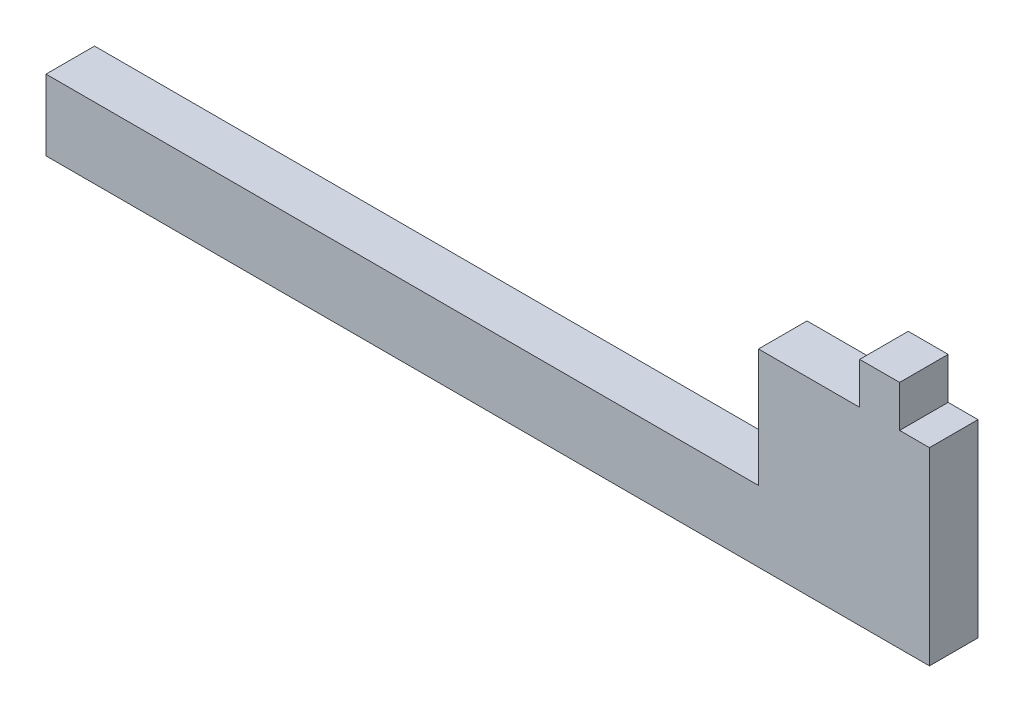
ISO-10303-21;
HEADER;
FILE_DESCRIPTION(('STEP AP214'),'2;1');
FILE_NAME('part.step','',(''),(''),'','','');
FILE_SCHEMA(('AUTOMOTIVE_DESIGN { 1 0 10303 214 1 1 1 1 }'));
ENDSEC;
DATA;
#1=APPLICATION_CONTEXT('core data for automotive mechanical design processes');
#2=APPLICATION_PROTOCOL_DEFINITION('international standard','automotive_design',2000,#1);
#3=PRODUCT_CONTEXT('',#1,'mechanical');
#4=PRODUCT('Part','Part','',(#3));
#5=PRODUCT_RELATED_PRODUCT_CATEGORY('part','',(#4));
#6=PRODUCT_DEFINITION_FORMATION('','',#4);
#7=PRODUCT_DEFINITION_CONTEXT('part definition',#1,'design');
#8=PRODUCT_DEFINITION('design','',#6,#7);
#9=PRODUCT_DEFINITION_SHAPE('','',#8);
#10=(LENGTH_UNIT() NAMED_UNIT(*) SI_UNIT(.MILLI.,.METRE.));
#11=(NAMED_UNIT(*) PLANE_ANGLE_UNIT() SI_UNIT($,.RADIAN.));
#12=(NAMED_UNIT(*) SI_UNIT($,.STERADIAN.) SOLID_ANGLE_UNIT());
#13=UNCERTAINTY_MEASURE_WITH_UNIT(LENGTH_MEASURE(1.E-05),#10,'distance_accuracy_value','');
#14=(GEOMETRIC_REPRESENTATION_CONTEXT(3) GLOBAL_UNCERTAINTY_ASSIGNED_CONTEXT((#13)) GLOBAL_UNIT_ASSIGNED_CONTEXT((#10,
#11,#12)) REPRESENTATION_CONTEXT('',''));
#15=CARTESIAN_POINT('',(0.,0.,0.));
#16=DIRECTION('',(0.,0.,1.));
#17=DIRECTION('',(1.,0.,0.));
#18=AXIS2_PLACEMENT_3D('',#15,#16,#17);
#19=CARTESIAN_POINT('',(90.985763710765,0.,9.144));
#20=DIRECTION('',(1.,0.,0.));
#21=DIRECTION('',(0.,0.,-1.));
#22=AXIS2_PLACEMENT_3D('',#19,#20,#21);
#23=PLANE('',#22);
#24=DIRECTION('',(0.,-1.,0.));
#25=VECTOR('',#24,1.);
#26=CARTESIAN_POINT('',(90.985763710765,0.,5.588));
#27=LINE('',#26,#25);
#28=CARTESIAN_POINT('',(90.985763710765,45.3470028132748,5.588));
#29=VERTEX_POINT('',#28);
#30=CARTESIAN_POINT('',(90.985763710765,42.3012441594208,5.588));
#31=VERTEX_POINT('',#30);
#32=EDGE_CURVE('E151',#29,#31,#27,.T.);
#33=ORIENTED_EDGE('',*,*,#32,.T.);
#34=DIRECTION('',(0.,0.,-1.));
#35=VECTOR('',#34,1.);
#36=CARTESIAN_POINT('',(90.985763710765,42.3012441594208,9.144));
#37=LINE('',#36,#35);
#38=CARTESIAN_POINT('',(90.985763710765,42.3012441594208,9.144));
#39=VERTEX_POINT('',#38);
#40=EDGE_CURVE('E11',#39,#31,#37,.T.);
#41=ORIENTED_EDGE('',*,*,#40,.F.);
#42=DIRECTION('',(0.,-1.,0.));
#43=VECTOR('',#42,1.);
#44=CARTESIAN_POINT('',(90.985763710765,0.,9.144));
#45=LINE('',#44,#43);
#46=CARTESIAN_POINT('',(90.985763710765,45.3470028132748,9.144));
#47=VERTEX_POINT('',#46);
#48=EDGE_CURVE('E169',#47,#39,#45,.T.);
#49=ORIENTED_EDGE('',*,*,#48,.F.);
#50=DIRECTION('',(0.,0.,-1.));
#51=VECTOR('',#50,1.);
#52=CARTESIAN_POINT('',(90.985763710765,45.3470028132748,9.144));
#53=LINE('',#52,#51);
#54=EDGE_CURVE('E147',#47,#29,#53,.T.);
#55=ORIENTED_EDGE('',*,*,#54,.T.);
#56=EDGE_LOOP('',(#33,#41,#49,#55));
#57=FACE_BOUND('',#56,.T.);
#58=ADVANCED_FACE('F43',(#57),#23,.F.);
#59=CARTESIAN_POINT('',(0.,42.3012441594208,9.144));
#60=DIRECTION('',(0.,-1.,0.));
#61=DIRECTION('',(0.,0.,-1.));
#62=AXIS2_PLACEMENT_3D('',#59,#60,#61);
#63=PLANE('',#62);
#64=DIRECTION('',(-1.,0.,0.));
#65=VECTOR('',#64,1.);
#66=CARTESIAN_POINT('',(0.,42.3012441594208,5.588));
#67=LINE('',#66,#65);
#68=CARTESIAN_POINT('',(83.5743801353392,42.3012441594208,5.588));
#69=VERTEX_POINT('',#68);
#70=EDGE_CURVE('E154',#31,#69,#67,.T.);
#71=ORIENTED_EDGE('',*,*,#70,.T.);
#72=DIRECTION('',(0.,0.,-1.));
#73=VECTOR('',#72,1.);
#74=CARTESIAN_POINT('',(83.5743801353392,42.3012441594208,9.144));
#75=LINE('',#74,#73);
#76=CARTESIAN_POINT('',(83.5743801353392,42.3012441594208,9.144));
#77=VERTEX_POINT('',#76);
#78=EDGE_CURVE('E51',#77,#69,#75,.T.);
#79=ORIENTED_EDGE('',*,*,#78,.F.);
#80=DIRECTION('',(-1.,0.,0.));
#81=VECTOR('',#80,1.);
#82=CARTESIAN_POINT('',(0.,42.3012441594208,9.144));
#83=LINE('',#82,#81);
#84=EDGE_CURVE('E108',#39,#77,#83,.T.);
#85=ORIENTED_EDGE('',*,*,#84,.F.);
#86=ORIENTED_EDGE('',*,*,#40,.T.);
#87=EDGE_LOOP('',(#71,#79,#85,#86));
#88=FACE_BOUND('',#87,.T.);
#89=ADVANCED_FACE('F218',(#88),#63,.F.);
#90=CARTESIAN_POINT('',(83.5743801353392,0.,9.144));
#91=DIRECTION('',(1.,0.,0.));
#92=DIRECTION('',(0.,0.,-1.));
#93=AXIS2_PLACEMENT_3D('',#90,#91,#92);
#94=PLANE('',#93);
#95=DIRECTION('',(0.,-1.,0.));
#96=VECTOR('',#95,1.);
#97=CARTESIAN_POINT('',(83.5743801353392,0.,5.588));
#98=LINE('',#97,#96);
#99=CARTESIAN_POINT('',(83.5743801353392,33.6426290683932,5.588));
#100=VERTEX_POINT('',#99);
#101=EDGE_CURVE('E156',#69,#100,#98,.T.);
#102=ORIENTED_EDGE('',*,*,#101,.T.);
#103=DIRECTION('',(0.,0.,-1.));
#104=VECTOR('',#103,1.);
#105=CARTESIAN_POINT('',(83.5743801353392,33.6426290683932,9.144));
#106=LINE('',#105,#104);
#107=CARTESIAN_POINT('',(83.5743801353392,33.6426290683932,9.144));
#108=VERTEX_POINT('',#107);
#109=EDGE_CURVE('E182',#108,#100,#106,.T.);
#110=ORIENTED_EDGE('',*,*,#109,.F.);
#111=DIRECTION('',(0.,-1.,0.));
#112=VECTOR('',#111,1.);
#113=CARTESIAN_POINT('',(83.5743801353392,0.,9.144));
#114=LINE('',#113,#112);
#115=EDGE_CURVE('E190',#77,#108,#114,.T.);
#116=ORIENTED_EDGE('',*,*,#115,.F.);
#117=ORIENTED_EDGE('',*,*,#78,.T.);
#118=EDGE_LOOP('',(#102,#110,#116,#117));
#119=FACE_BOUND('',#118,.T.);
#120=ADVANCED_FACE('F188',(#119),#94,.F.);
#121=CARTESIAN_POINT('',(0.,33.6426290683932,9.144));
#122=DIRECTION('',(0.,-1.,0.));
#123=DIRECTION('',(0.,0.,-1.));
#124=AXIS2_PLACEMENT_3D('',#121,#122,#123);
#125=PLANE('',#124);
#126=DIRECTION('',(-1.,0.,0.));
#127=VECTOR('',#126,1.);
#128=CARTESIAN_POINT('',(0.,33.6426290683932,5.588));
#129=LINE('',#128,#127);
#130=CARTESIAN_POINT('',(31.390903290393,33.6426290683932,5.588));
#131=VERTEX_POINT('',#130);
#132=EDGE_CURVE('E158',#100,#131,#129,.T.);
#133=ORIENTED_EDGE('',*,*,#132,.T.);
#134=DIRECTION('',(0.,0.,-1.));
#135=VECTOR('',#134,1.);
#136=CARTESIAN_POINT('',(31.390903290393,33.6426290683932,9.144));
#137=LINE('',#136,#135);
#138=CARTESIAN_POINT('',(31.390903290393,33.6426290683932,9.144));
#139=VERTEX_POINT('',#138);
#140=EDGE_CURVE('E179',#139,#131,#137,.T.);
#141=ORIENTED_EDGE('',*,*,#140,.F.);
#142=DIRECTION('',(-1.,0.,0.));
#143=VECTOR('',#142,1.);
#144=CARTESIAN_POINT('',(0.,33.6426290683932,9.144));
#145=LINE('',#144,#143);
#146=EDGE_CURVE('E208',#108,#139,#145,.T.);
#147=ORIENTED_EDGE('',*,*,#146,.F.);
#148=ORIENTED_EDGE('',*,*,#109,.T.);
#149=EDGE_LOOP('',(#133,#141,#147,#148));
#150=FACE_BOUND('',#149,.T.);
#151=ADVANCED_FACE('F199',(#150),#125,.F.);
#152=CARTESIAN_POINT('',(31.390903290393,0.,9.144));
#153=DIRECTION('',(1.,0.,0.));
#154=DIRECTION('',(0.,0.,-1.));
#155=AXIS2_PLACEMENT_3D('',#152,#153,#154);
#156=PLANE('',#155);
#157=DIRECTION('',(0.,-1.,0.));
#158=VECTOR('',#157,1.);
#159=CARTESIAN_POINT('',(31.390903290393,0.,5.588));
#160=LINE('',#159,#158);
#161=CARTESIAN_POINT('',(31.390903290393,28.4550367389928,5.588));
#162=VERTEX_POINT('',#161);
#163=EDGE_CURVE('E160',#131,#162,#160,.T.);
#164=ORIENTED_EDGE('',*,*,#163,.T.);
#165=DIRECTION('',(0.,0.,-1.));
#166=VECTOR('',#165,1.);
#167=CARTESIAN_POINT('',(31.390903290393,28.4550367389928,9.144));
#168=LINE('',#167,#166);
#169=CARTESIAN_POINT('',(31.390903290393,28.4550367389928,9.144));
#170=VERTEX_POINT('',#169);
#171=EDGE_CURVE('E176',#170,#162,#168,.T.);
#172=ORIENTED_EDGE('',*,*,#171,.F.);
#173=DIRECTION('',(0.,-1.,0.));
#174=VECTOR('',#173,1.);
#175=CARTESIAN_POINT('',(31.390903290393,0.,9.144));
#176=LINE('',#175,#174);
#177=EDGE_CURVE('E205',#139,#170,#176,.T.);
#178=ORIENTED_EDGE('',*,*,#177,.F.);
#179=ORIENTED_EDGE('',*,*,#140,.T.);
#180=EDGE_LOOP('',(#164,#172,#178,#179));
#181=FACE_BOUND('',#180,.T.);
#182=ADVANCED_FACE('F203',(#181),#156,.F.);
#183=CARTESIAN_POINT('',(0.,28.4550367389928,9.144));
#184=DIRECTION('',(0.,1.,0.));
#185=DIRECTION('',(0.,0.,1.));
#186=AXIS2_PLACEMENT_3D('',#183,#184,#185);
#187=PLANE('',#186);
#188=DIRECTION('',(1.,0.,0.));
#189=VECTOR('',#188,1.);
#190=CARTESIAN_POINT('',(0.,28.4550367389928,5.588));
#191=LINE('',#190,#189);
#192=CARTESIAN_POINT('',(96.0957504485511,28.4550367389928,5.588));
#193=VERTEX_POINT('',#192);
#194=EDGE_CURVE('E162',#162,#193,#191,.T.);
#195=ORIENTED_EDGE('',*,*,#194,.T.);
#196=DIRECTION('',(0.,0.,-1.));
#197=VECTOR('',#196,1.);
#198=CARTESIAN_POINT('',(96.0957504485511,28.4550367389928,9.144));
#199=LINE('',#198,#197);
#200=CARTESIAN_POINT('',(96.0957504485511,28.4550367389928,9.144));
#201=VERTEX_POINT('',#200);
#202=EDGE_CURVE('E173',#201,#193,#199,.T.);
#203=ORIENTED_EDGE('',*,*,#202,.F.);
#204=DIRECTION('',(1.,0.,0.));
#205=VECTOR('',#204,1.);
#206=CARTESIAN_POINT('',(0.,28.4550367389928,9.144));
#207=LINE('',#206,#205);
#208=EDGE_CURVE('E207',#170,#201,#207,.T.);
#209=ORIENTED_EDGE('',*,*,#208,.F.);
#210=ORIENTED_EDGE('',*,*,#171,.T.);
#211=EDGE_LOOP('',(#195,#203,#209,#210));
#212=FACE_BOUND('',#211,.T.);
#213=ADVANCED_FACE('F230',(#212),#187,.F.);
#214=CARTESIAN_POINT('',(96.0957504485511,0.,9.144));
#215=DIRECTION('',(-1.,0.,0.));
#216=DIRECTION('',(0.,0.,1.));
#217=AXIS2_PLACEMENT_3D('',#214,#215,#216);
#218=PLANE('',#217);
#219=DIRECTION('',(0.,1.,0.));
#220=VECTOR('',#219,1.);
#221=CARTESIAN_POINT('',(96.0957504485511,0.,5.588));
#222=LINE('',#221,#220);
#223=CARTESIAN_POINT('',(96.0957504485511,42.3012441594208,5.588));
#224=VERTEX_POINT('',#223);
#225=EDGE_CURVE('E164',#193,#224,#222,.T.);
#226=ORIENTED_EDGE('',*,*,#225,.T.);
#227=DIRECTION('',(0.,0.,-1.));
#228=VECTOR('',#227,1.);
#229=CARTESIAN_POINT('',(96.0957504485511,42.3012441594208,9.144));
#230=LINE('',#229,#228);
#231=CARTESIAN_POINT('',(96.0957504485511,42.3012441594208,9.144));
#232=VERTEX_POINT('',#231);
#233=EDGE_CURVE('E142',#232,#224,#230,.T.);
#234=ORIENTED_EDGE('',*,*,#233,.F.);
#235=DIRECTION('',(0.,1.,0.));
#236=VECTOR('',#235,1.);
#237=CARTESIAN_POINT('',(96.0957504485511,0.,9.144));
#238=LINE('',#237,#236);
#239=EDGE_CURVE('E133',#201,#232,#238,.T.);
#240=ORIENTED_EDGE('',*,*,#239,.F.);
#241=ORIENTED_EDGE('',*,*,#202,.T.);
#242=EDGE_LOOP('',(#226,#234,#240,#241));
#243=FACE_BOUND('',#242,.T.);
#244=ADVANCED_FACE('F233',(#243),#218,.F.);
#245=CARTESIAN_POINT('',(0.,42.3012441594208,9.144));
#246=DIRECTION('',(0.,-1.,0.));
#247=DIRECTION('',(0.,0.,-1.));
#248=AXIS2_PLACEMENT_3D('',#245,#246,#247);
#249=PLANE('',#248);
#250=DIRECTION('',(-1.,0.,0.));
#251=VECTOR('',#250,1.);
#252=CARTESIAN_POINT('',(0.,42.3012441594208,5.588));
#253=LINE('',#252,#251);
#254=CARTESIAN_POINT('',(93.9105154479826,42.3012441594208,5.588));
#255=VERTEX_POINT('',#254);
#256=EDGE_CURVE('E141',#224,#255,#253,.T.);
#257=ORIENTED_EDGE('',*,*,#256,.T.);
#258=DIRECTION('',(0.,0.,-1.));
#259=VECTOR('',#258,1.);
#260=CARTESIAN_POINT('',(93.9105154479826,42.3012441594208,9.144));
#261=LINE('',#260,#259);
#262=CARTESIAN_POINT('',(93.9105154479826,42.3012441594208,9.144));
#263=VERTEX_POINT('',#262);
#264=EDGE_CURVE('E138',#263,#255,#261,.T.);
#265=ORIENTED_EDGE('',*,*,#264,.F.);
#266=DIRECTION('',(-1.,0.,0.));
#267=VECTOR('',#266,1.);
#268=CARTESIAN_POINT('',(0.,42.3012441594208,9.144));
#269=LINE('',#268,#267);
#270=EDGE_CURVE('E127',#232,#263,#269,.T.);
#271=ORIENTED_EDGE('',*,*,#270,.F.);
#272=ORIENTED_EDGE('',*,*,#233,.T.);
#273=EDGE_LOOP('',(#257,#265,#271,#272));
#274=FACE_BOUND('',#273,.T.);
#275=ADVANCED_FACE('F139',(#274),#249,.F.);
#276=CARTESIAN_POINT('',(93.9105154479826,0.,9.144));
#277=DIRECTION('',(-1.,0.,0.));
#278=DIRECTION('',(0.,0.,1.));
#279=AXIS2_PLACEMENT_3D('',#276,#277,#278);
#280=PLANE('',#279);
#281=DIRECTION('',(0.,1.,0.));
#282=VECTOR('',#281,1.);
#283=CARTESIAN_POINT('',(93.9105154479826,0.,5.588));
#284=LINE('',#283,#282);
#285=CARTESIAN_POINT('',(93.9105154479826,45.3470028132748,5.588));
#286=VERTEX_POINT('',#285);
#287=EDGE_CURVE('E94',#255,#286,#284,.T.);
#288=ORIENTED_EDGE('',*,*,#287,.T.);
#289=DIRECTION('',(0.,0.,-1.));
#290=VECTOR('',#289,1.);
#291=CARTESIAN_POINT('',(93.9105154479826,45.3470028132748,9.144));
#292=LINE('',#291,#290);
#293=CARTESIAN_POINT('',(93.9105154479826,45.3470028132748,9.144));
#294=VERTEX_POINT('',#293);
#295=EDGE_CURVE('E143',#294,#286,#292,.T.);
#296=ORIENTED_EDGE('',*,*,#295,.F.);
#297=DIRECTION('',(0.,1.,0.));
#298=VECTOR('',#297,1.);
#299=CARTESIAN_POINT('',(93.9105154479826,0.,9.144));
#300=LINE('',#299,#298);
#301=EDGE_CURVE('E131',#263,#294,#300,.T.);
#302=ORIENTED_EDGE('',*,*,#301,.F.);
#303=ORIENTED_EDGE('',*,*,#264,.T.);
#304=EDGE_LOOP('',(#288,#296,#302,#303));
#305=FACE_BOUND('',#304,.T.);
#306=ADVANCED_FACE('F145',(#305),#280,.F.);
#307=CARTESIAN_POINT('',(0.,45.347002813275,9.144));
#308=DIRECTION('',(0.,-1.,0.));
#309=DIRECTION('',(1.,0.,0.));
#310=AXIS2_PLACEMENT_3D('',#307,#308,#309);
#311=PLANE('',#310);
#312=DIRECTION('',(-1.,0.,0.));
#313=VECTOR('',#312,1.);
#314=CARTESIAN_POINT('',(0.,45.347002813275,5.588));
#315=LINE('',#314,#313);
#316=EDGE_CURVE('E100',#286,#29,#315,.T.);
#317=ORIENTED_EDGE('',*,*,#316,.T.);
#318=ORIENTED_EDGE('',*,*,#54,.F.);
#319=DIRECTION('',(-1.,0.,0.));
#320=VECTOR('',#319,1.);
#321=CARTESIAN_POINT('',(0.,45.347002813275,9.144));
#322=LINE('',#321,#320);
#323=EDGE_CURVE('E59',#294,#47,#322,.T.);
#324=ORIENTED_EDGE('',*,*,#323,.F.);
#325=ORIENTED_EDGE('',*,*,#295,.T.);
#326=EDGE_LOOP('',(#317,#318,#324,#325));
#327=FACE_BOUND('',#326,.T.);
#328=ADVANCED_FACE('F242',(#327),#311,.F.);
#329=CARTESIAN_POINT('',(0.,0.,9.144));
#330=DIRECTION('',(0.,0.,1.));
#331=DIRECTION('',(1.,0.,0.));
#332=AXIS2_PLACEMENT_3D('',#329,#330,#331);
#333=PLANE('',#332);
#334=ORIENTED_EDGE('',*,*,#48,.T.);
#335=ORIENTED_EDGE('',*,*,#84,.T.);
#336=ORIENTED_EDGE('',*,*,#115,.T.);
#337=ORIENTED_EDGE('',*,*,#146,.T.);
#338=ORIENTED_EDGE('',*,*,#177,.T.);
#339=ORIENTED_EDGE('',*,*,#208,.T.);
#340=ORIENTED_EDGE('',*,*,#239,.T.);
#341=ORIENTED_EDGE('',*,*,#270,.T.);
#342=ORIENTED_EDGE('',*,*,#301,.T.);
#343=ORIENTED_EDGE('',*,*,#323,.T.);
#344=EDGE_LOOP('',(#334,#335,#336,#337,#338,#339,#340,#341,#342,#343));
#345=FACE_BOUND('',#344,.T.);
#346=ADVANCED_FACE('F129',(#345),#333,.T.);
#347=CARTESIAN_POINT('',(0.,0.,5.588));
#348=DIRECTION('',(0.,0.,1.));
#349=DIRECTION('',(1.,0.,0.));
#350=AXIS2_PLACEMENT_3D('',#347,#348,#349);
#351=PLANE('',#350);
#352=ORIENTED_EDGE('',*,*,#32,.F.);
#353=ORIENTED_EDGE('',*,*,#316,.F.);
#354=ORIENTED_EDGE('',*,*,#287,.F.);
#355=ORIENTED_EDGE('',*,*,#256,.F.);
#356=ORIENTED_EDGE('',*,*,#225,.F.);
#357=ORIENTED_EDGE('',*,*,#194,.F.);
#358=ORIENTED_EDGE('',*,*,#163,.F.);
#359=ORIENTED_EDGE('',*,*,#132,.F.);
#360=ORIENTED_EDGE('',*,*,#101,.F.);
#361=ORIENTED_EDGE('',*,*,#70,.F.);
#362=EDGE_LOOP('',(#352,#353,#354,#355,#356,#357,#358,#359,#360,#361));
#363=FACE_BOUND('',#362,.T.);
#364=ADVANCED_FACE('F194',(#363),#351,.F.);
#365=CLOSED_SHELL('',(#58,#89,#120,#151,#182,#213,#244,#275,#306,#328,#346,#364));
#366=MANIFOLD_SOLID_BREP('B2',#365);
#367=ADVANCED_BREP_SHAPE_REPRESENTATION('',(#18,#366),#14);
#368=SHAPE_DEFINITION_REPRESENTATION(#9,#367);
ENDSEC;
END-ISO-10303-21;
